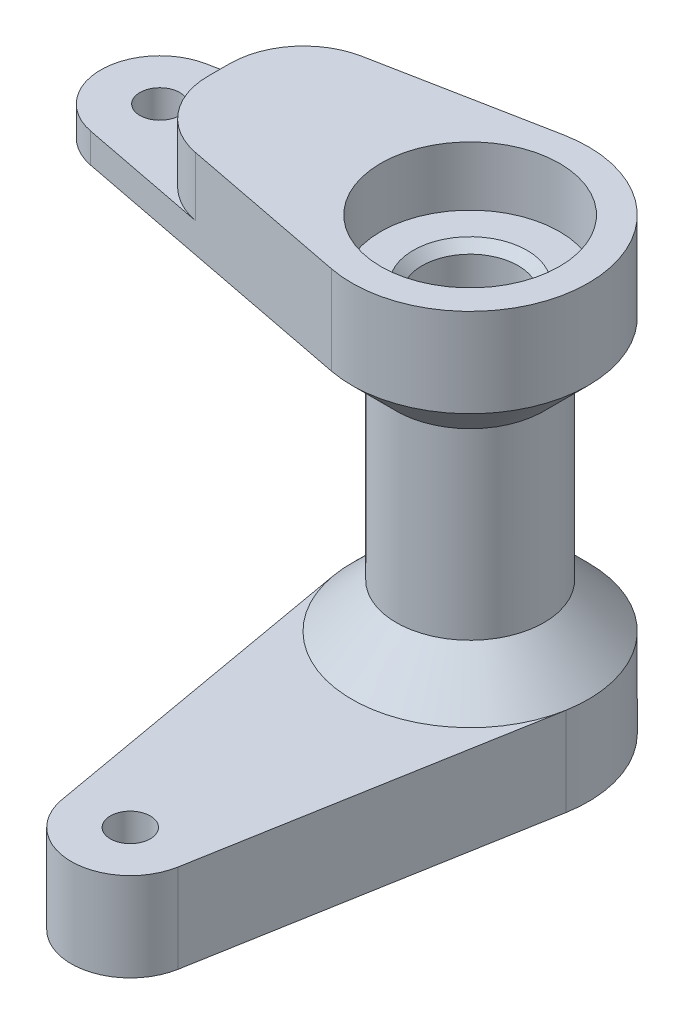
ISO-10303-21;
HEADER;
FILE_DESCRIPTION(('STEP AP214'),'2;1');
FILE_NAME('part.step','',(''),(''),'','','');
FILE_SCHEMA(('AUTOMOTIVE_DESIGN { 1 0 10303 214 1 1 1 1 }'));
ENDSEC;
DATA;
#1=APPLICATION_CONTEXT('core data for automotive mechanical design processes');
#2=APPLICATION_PROTOCOL_DEFINITION('international standard','automotive_design',2000,#1);
#3=PRODUCT_CONTEXT('',#1,'mechanical');
#4=PRODUCT('Part','Part','',(#3));
#5=PRODUCT_RELATED_PRODUCT_CATEGORY('part','',(#4));
#6=PRODUCT_DEFINITION_FORMATION('','',#4);
#7=PRODUCT_DEFINITION_CONTEXT('part definition',#1,'design');
#8=PRODUCT_DEFINITION('design','',#6,#7);
#9=PRODUCT_DEFINITION_SHAPE('','',#8);
#10=(LENGTH_UNIT() NAMED_UNIT(*) SI_UNIT(.MILLI.,.METRE.));
#11=(NAMED_UNIT(*) PLANE_ANGLE_UNIT() SI_UNIT($,.RADIAN.));
#12=(NAMED_UNIT(*) SI_UNIT($,.STERADIAN.) SOLID_ANGLE_UNIT());
#13=UNCERTAINTY_MEASURE_WITH_UNIT(LENGTH_MEASURE(1.E-05),#10,'distance_accuracy_value','');
#14=(GEOMETRIC_REPRESENTATION_CONTEXT(3) GLOBAL_UNCERTAINTY_ASSIGNED_CONTEXT((#13)) GLOBAL_UNIT_ASSIGNED_CONTEXT((#10,
#11,#12)) REPRESENTATION_CONTEXT('',''));
#15=CARTESIAN_POINT('',(0.,0.,0.));
#16=DIRECTION('',(0.,0.,1.));
#17=DIRECTION('',(1.,0.,0.));
#18=AXIS2_PLACEMENT_3D('',#15,#16,#17);
#19=CARTESIAN_POINT('',(-6.05000000000001,30.4,0.));
#20=DIRECTION('',(0.,-1.,0.));
#21=DIRECTION('',(0.,0.,-1.));
#22=AXIS2_PLACEMENT_3D('',#19,#20,#21);
#23=PLANE('',#22);
#24=CARTESIAN_POINT('',(0.,30.4,0.));
#25=DIRECTION('',(0.,-1.,0.));
#26=DIRECTION('',(0.,0.,-1.));
#27=AXIS2_PLACEMENT_3D('',#24,#25,#26);
#28=CIRCLE('',#27,6.05000000000001);
#29=CARTESIAN_POINT('',(0.,30.4,-6.05000000000001));
#30=VERTEX_POINT('',#29);
#31=EDGE_CURVE('E235',#30,#30,#28,.T.);
#32=ORIENTED_EDGE('',*,*,#31,.T.);
#33=EDGE_LOOP('',(#32));
#34=FACE_BOUND('',#33,.T.);
#35=DIRECTION('',(0.,0.,-1.));
#36=VECTOR('',#35,1.);
#37=CARTESIAN_POINT('',(-17.,30.4,27.001));
#38=LINE('',#37,#36);
#39=CARTESIAN_POINT('',(-17.,30.4,0.72760687510888));
#40=VERTEX_POINT('',#39);
#41=CARTESIAN_POINT('',(-17.,30.4,-0.72760687510913));
#42=VERTEX_POINT('',#41);
#43=EDGE_CURVE('E299',#40,#42,#38,.T.);
#44=ORIENTED_EDGE('',*,*,#43,.F.);
#45=CARTESIAN_POINT('',(-12.,30.4,0.72760687510888));
#46=DIRECTION('',(0.,-1.,0.));
#47=DIRECTION('',(0.,0.,-1.));
#48=AXIS2_PLACEMENT_3D('',#45,#46,#47);
#49=CIRCLE('',#48,5.);
#50=CARTESIAN_POINT('',(-12.952380952381,30.4,5.63606595322513));
#51=VERTEX_POINT('',#50);
#52=EDGE_CURVE('E277',#40,#51,#49,.F.);
#53=ORIENTED_EDGE('',*,*,#52,.T.);
#54=DIRECTION('',(0.98169181562325,0.,0.190476190476201));
#55=VECTOR('',#54,1.);
#56=CARTESIAN_POINT('',(-21.7619047619048,30.4,3.92676726249278));
#57=LINE('',#56,#55);
#58=CARTESIAN_POINT('',(-1.52380952380961,30.4,7.85353452498602));
#59=VERTEX_POINT('',#58);
#60=EDGE_CURVE('E305',#51,#59,#57,.T.);
#61=ORIENTED_EDGE('',*,*,#60,.T.);
#62=CARTESIAN_POINT('',(0.,30.4,0.));
#63=DIRECTION('',(0.,-1.,0.));
#64=DIRECTION('',(0.,0.,-1.));
#65=AXIS2_PLACEMENT_3D('',#62,#63,#64);
#66=CIRCLE('',#65,8.00000000000001);
#67=CARTESIAN_POINT('',(-1.52380952380945,30.4,-7.85353452498605));
#68=VERTEX_POINT('',#67);
#69=EDGE_CURVE('E231',#68,#59,#66,.T.);
#70=ORIENTED_EDGE('',*,*,#69,.F.);
#71=DIRECTION('',(-0.981691815623254,0.,0.190476190476181));
#72=VECTOR('',#71,1.);
#73=CARTESIAN_POINT('',(-21.7619047619047,30.4,-3.92676726249324));
#74=LINE('',#73,#72);
#75=CARTESIAN_POINT('',(-12.9523809523809,30.4,-5.6360659532254));
#76=VERTEX_POINT('',#75);
#77=EDGE_CURVE('E161',#68,#76,#74,.T.);
#78=ORIENTED_EDGE('',*,*,#77,.T.);
#79=CARTESIAN_POINT('',(-12.,30.4,-0.72760687510913));
#80=DIRECTION('',(0.,-1.,0.));
#81=DIRECTION('',(0.,0.,-1.));
#82=AXIS2_PLACEMENT_3D('',#79,#80,#81);
#83=CIRCLE('',#82,5.);
#84=EDGE_CURVE('E274',#76,#42,#83,.F.);
#85=ORIENTED_EDGE('',*,*,#84,.T.);
#86=EDGE_LOOP('',(#44,#53,#61,#70,#78,#85));
#87=FACE_BOUND('',#86,.T.);
#88=ADVANCED_FACE('F38',(#34,#87),#23,.F.);
#89=CARTESIAN_POINT('',(-21.,24.4,-2.19963324347117E-13));
#90=DIRECTION('',(0.,1.,0.));
#91=DIRECTION('',(0.,0.,1.));
#92=AXIS2_PLACEMENT_3D('',#89,#90,#91);
#93=CYLINDRICAL_SURFACE('',#92,4.);
#94=DIRECTION('',(0.,1.,0.));
#95=VECTOR('',#94,1.);
#96=CARTESIAN_POINT('',(-21.7619047619048,24.4,3.92676726249278));
#97=LINE('',#96,#95);
#98=CARTESIAN_POINT('',(-21.7619047619048,24.4,3.92676726249278));
#99=VERTEX_POINT('',#98);
#100=CARTESIAN_POINT('',(-21.7619047619048,26.4,3.92676726249278));
#101=VERTEX_POINT('',#100);
#102=EDGE_CURVE('E141',#99,#101,#97,.T.);
#103=ORIENTED_EDGE('',*,*,#102,.T.);
#104=CARTESIAN_POINT('',(-21.,26.4,-2.19963324347117E-13));
#105=DIRECTION('',(0.,1.,0.));
#106=DIRECTION('',(0.,0.,1.));
#107=AXIS2_PLACEMENT_3D('',#104,#105,#106);
#108=CIRCLE('',#107,4.);
#109=CARTESIAN_POINT('',(-21.7619047619047,26.4,-3.92676726249324));
#110=VERTEX_POINT('',#109);
#111=EDGE_CURVE('E128',#110,#101,#108,.T.);
#112=ORIENTED_EDGE('',*,*,#111,.F.);
#113=DIRECTION('',(0.,1.,0.));
#114=VECTOR('',#113,1.);
#115=CARTESIAN_POINT('',(-21.7619047619047,24.4,-3.92676726249324));
#116=LINE('',#115,#114);
#117=CARTESIAN_POINT('',(-21.7619047619047,24.4,-3.92676726249324));
#118=VERTEX_POINT('',#117);
#119=EDGE_CURVE('E139',#118,#110,#116,.T.);
#120=ORIENTED_EDGE('',*,*,#119,.F.);
#121=CARTESIAN_POINT('',(-21.,24.4,-2.19963324347117E-13));
#122=DIRECTION('',(0.,1.,0.));
#123=DIRECTION('',(0.,0.,1.));
#124=AXIS2_PLACEMENT_3D('',#121,#122,#123);
#125=CIRCLE('',#124,4.);
#126=EDGE_CURVE('E314',#118,#99,#125,.T.);
#127=ORIENTED_EDGE('',*,*,#126,.T.);
#128=EDGE_LOOP('',(#103,#112,#120,#127));
#129=FACE_BOUND('',#128,.T.);
#130=ADVANCED_FACE('F137',(#129),#93,.T.);
#131=CARTESIAN_POINT('',(-21.7619047619047,24.4,-3.92676726249324));
#132=DIRECTION('',(-0.190476190476181,0.,-0.981691815623254));
#133=DIRECTION('',(-0.981691815623254,0.,0.190476190476181));
#134=AXIS2_PLACEMENT_3D('',#131,#132,#133);
#135=PLANE('',#134);
#136=DIRECTION('',(0.981691815623254,0.,-0.190476190476181));
#137=VECTOR('',#136,1.);
#138=CARTESIAN_POINT('',(-24.1206817183417,26.4,-3.46909730773266));
#139=LINE('',#138,#137);
#140=CARTESIAN_POINT('',(-12.9523809523809,26.4,-5.6360659532254));
#141=VERTEX_POINT('',#140);
#142=EDGE_CURVE('E54',#110,#141,#139,.T.);
#143=ORIENTED_EDGE('',*,*,#142,.T.);
#144=DIRECTION('',(0.,1.,0.));
#145=VECTOR('',#144,1.);
#146=CARTESIAN_POINT('',(-12.9523809523809,24.4,-5.6360659532254));
#147=LINE('',#146,#145);
#148=EDGE_CURVE('E283',#141,#76,#147,.T.);
#149=ORIENTED_EDGE('',*,*,#148,.T.);
#150=ORIENTED_EDGE('',*,*,#77,.F.);
#151=DIRECTION('',(0.,1.,0.));
#152=VECTOR('',#151,1.);
#153=CARTESIAN_POINT('',(-1.52380952380945,24.4,-7.85353452498605));
#154=LINE('',#153,#152);
#155=CARTESIAN_POINT('',(-1.52380952380945,24.4,-7.85353452498604));
#156=VERTEX_POINT('',#155);
#157=EDGE_CURVE('E150',#156,#68,#154,.T.);
#158=ORIENTED_EDGE('',*,*,#157,.F.);
#159=DIRECTION('',(-0.981691815623254,0.,0.190476190476181));
#160=VECTOR('',#159,1.);
#161=CARTESIAN_POINT('',(-21.7619047619047,24.4,-3.92676726249324));
#162=LINE('',#161,#160);
#163=EDGE_CURVE('E147',#156,#118,#162,.T.);
#164=ORIENTED_EDGE('',*,*,#163,.T.);
#165=ORIENTED_EDGE('',*,*,#119,.T.);
#166=EDGE_LOOP('',(#143,#149,#150,#158,#164,#165));
#167=FACE_BOUND('',#166,.T.);
#168=ADVANCED_FACE('F145',(#167),#135,.T.);
#169=CARTESIAN_POINT('',(-21.7619047619048,24.4,3.92676726249278));
#170=DIRECTION('',(-0.190476190476201,0.,0.981691815623251));
#171=DIRECTION('',(0.98169181562325,0.,0.190476190476201));
#172=AXIS2_PLACEMENT_3D('',#169,#170,#171);
#173=PLANE('',#172);
#174=ORIENTED_EDGE('',*,*,#60,.F.);
#175=DIRECTION('',(0.,1.,0.));
#176=VECTOR('',#175,1.);
#177=CARTESIAN_POINT('',(-12.952380952381,24.4,5.63606595322513));
#178=LINE('',#177,#176);
#179=CARTESIAN_POINT('',(-12.952380952381,26.4,5.63606595322513));
#180=VERTEX_POINT('',#179);
#181=EDGE_CURVE('E280',#51,#180,#178,.F.);
#182=ORIENTED_EDGE('',*,*,#181,.T.);
#183=DIRECTION('',(0.98169181562325,0.,0.190476190476201));
#184=VECTOR('',#183,1.);
#185=CARTESIAN_POINT('',(-20.5678922903715,26.4,4.1584397113604));
#186=LINE('',#185,#184);
#187=EDGE_CURVE('E61',#101,#180,#186,.T.);
#188=ORIENTED_EDGE('',*,*,#187,.F.);
#189=ORIENTED_EDGE('',*,*,#102,.F.);
#190=DIRECTION('',(0.98169181562325,0.,0.190476190476201));
#191=VECTOR('',#190,1.);
#192=CARTESIAN_POINT('',(-21.7619047619048,24.4,3.92676726249278));
#193=LINE('',#192,#191);
#194=CARTESIAN_POINT('',(-1.52380952380961,24.4,7.85353452498602));
#195=VERTEX_POINT('',#194);
#196=EDGE_CURVE('E320',#99,#195,#193,.T.);
#197=ORIENTED_EDGE('',*,*,#196,.T.);
#198=DIRECTION('',(0.,1.,0.));
#199=VECTOR('',#198,1.);
#200=CARTESIAN_POINT('',(-1.52380952380961,24.4,7.85353452498602));
#201=LINE('',#200,#199);
#202=EDGE_CURVE('E158',#195,#59,#201,.T.);
#203=ORIENTED_EDGE('',*,*,#202,.T.);
#204=EDGE_LOOP('',(#174,#182,#188,#189,#197,#203));
#205=FACE_BOUND('',#204,.T.);
#206=ADVANCED_FACE('F307',(#205),#173,.T.);
#207=CARTESIAN_POINT('',(-21.,24.4,-2.19963324347117E-13));
#208=DIRECTION('',(0.,1.,0.));
#209=DIRECTION('',(0.,0.,1.));
#210=AXIS2_PLACEMENT_3D('',#207,#208,#209);
#211=CYLINDRICAL_SURFACE('',#210,1.35);
#212=CARTESIAN_POINT('',(-21.,24.4,-2.19963324347117E-13));
#213=DIRECTION('',(0.,1.,0.));
#214=DIRECTION('',(0.,0.,1.));
#215=AXIS2_PLACEMENT_3D('',#212,#213,#214);
#216=CIRCLE('',#215,1.35);
#217=CARTESIAN_POINT('',(-21.,24.4,1.34999999999978));
#218=VERTEX_POINT('',#217);
#219=EDGE_CURVE('E298',#218,#218,#216,.T.);
#220=ORIENTED_EDGE('',*,*,#219,.F.);
#221=EDGE_LOOP('',(#220));
#222=FACE_BOUND('',#221,.T.);
#223=CARTESIAN_POINT('',(-21.,26.4,-2.19963324347117E-13));
#224=DIRECTION('',(0.,1.,0.));
#225=DIRECTION('',(0.,0.,1.));
#226=AXIS2_PLACEMENT_3D('',#223,#224,#225);
#227=CIRCLE('',#226,1.35);
#228=CARTESIAN_POINT('',(-21.,26.4,1.34999999999978));
#229=VERTEX_POINT('',#228);
#230=EDGE_CURVE('E133',#229,#229,#227,.T.);
#231=ORIENTED_EDGE('',*,*,#230,.T.);
#232=EDGE_LOOP('',(#231));
#233=FACE_BOUND('',#232,.T.);
#234=ADVANCED_FACE('F333',(#222,#233),#211,.F.);
#235=CARTESIAN_POINT('',(0.,-1.14422068437634,0.));
#236=DIRECTION('',(0.,-1.,0.));
#237=DIRECTION('',(0.,0.,-1.));
#238=AXIS2_PLACEMENT_3D('',#235,#236,#237);
#239=CYLINDRICAL_SURFACE('',#238,8.00000000000001);
#240=ORIENTED_EDGE('',*,*,#157,.T.);
#241=ORIENTED_EDGE('',*,*,#69,.T.);
#242=ORIENTED_EDGE('',*,*,#202,.F.);
#243=CARTESIAN_POINT('',(0.,24.4,0.));
#244=DIRECTION('',(0.,-1.,0.));
#245=DIRECTION('',(0.,0.,-1.));
#246=AXIS2_PLACEMENT_3D('',#243,#244,#245);
#247=CIRCLE('',#246,8.);
#248=EDGE_CURVE('E226',#156,#195,#247,.T.);
#249=ORIENTED_EDGE('',*,*,#248,.F.);
#250=EDGE_LOOP('',(#240,#241,#242,#249));
#251=FACE_BOUND('',#250,.T.);
#252=ADVANCED_FACE('F358',(#251),#239,.T.);
#253=CARTESIAN_POINT('',(-7.99999999999998,0.,0.));
#254=DIRECTION('',(0.,1.,0.));
#255=DIRECTION('',(0.,0.,1.));
#256=AXIS2_PLACEMENT_3D('',#253,#254,#255);
#257=PLANE('',#256);
#258=CARTESIAN_POINT('',(0.,0.,0.));
#259=DIRECTION('',(0.,-1.,0.));
#260=DIRECTION('',(0.,0.,-1.));
#261=AXIS2_PLACEMENT_3D('',#258,#259,#260);
#262=CIRCLE('',#261,6.04999999999997);
#263=CARTESIAN_POINT('',(0.,0.,-6.04999999999997));
#264=VERTEX_POINT('',#263);
#265=EDGE_CURVE('E263',#264,#264,#262,.T.);
#266=ORIENTED_EDGE('',*,*,#265,.F.);
#267=EDGE_LOOP('',(#266));
#268=FACE_BOUND('',#267,.T.);
#269=CARTESIAN_POINT('',(0.,0.,0.));
#270=DIRECTION('',(0.,-1.,0.));
#271=DIRECTION('',(0.,0.,-1.));
#272=AXIS2_PLACEMENT_3D('',#269,#270,#271);
#273=CIRCLE('',#272,7.99999999999998);
#274=CARTESIAN_POINT('',(-7.87808810636948,0.,1.39130434782608));
#275=VERTEX_POINT('',#274);
#276=CARTESIAN_POINT('',(7.87808810636946,0.,1.39130434782608));
#277=VERTEX_POINT('',#276);
#278=EDGE_CURVE('E209',#275,#277,#273,.T.);
#279=ORIENTED_EDGE('',*,*,#278,.T.);
#280=DIRECTION('',(0.173913043478261,0.,-0.984761013296185));
#281=VECTOR('',#280,1.);
#282=CARTESIAN_POINT('',(3.93904405318474,0.,23.695652173913));
#283=LINE('',#282,#281);
#284=CARTESIAN_POINT('',(3.93904405318474,0.,23.695652173913));
#285=VERTEX_POINT('',#284);
#286=EDGE_CURVE('E189',#285,#277,#283,.T.);
#287=ORIENTED_EDGE('',*,*,#286,.F.);
#288=CARTESIAN_POINT('',(0.,0.,23.));
#289=DIRECTION('',(0.,1.,0.));
#290=DIRECTION('',(0.,0.,-1.));
#291=AXIS2_PLACEMENT_3D('',#288,#289,#290);
#292=CIRCLE('',#291,4.);
#293=CARTESIAN_POINT('',(-3.93904405318474,0.,23.695652173913));
#294=VERTEX_POINT('',#293);
#295=EDGE_CURVE('E171',#294,#285,#292,.T.);
#296=ORIENTED_EDGE('',*,*,#295,.F.);
#297=DIRECTION('',(0.173913043478261,0.,0.984761013296185));
#298=VECTOR('',#297,1.);
#299=CARTESIAN_POINT('',(-7.87808810636948,0.,1.39130434782609));
#300=LINE('',#299,#298);
#301=EDGE_CURVE('E178',#275,#294,#300,.T.);
#302=ORIENTED_EDGE('',*,*,#301,.F.);
#303=EDGE_LOOP('',(#279,#287,#296,#302));
#304=FACE_BOUND('',#303,.T.);
#305=CARTESIAN_POINT('',(0.,0.,23.));
#306=DIRECTION('',(0.,1.,0.));
#307=DIRECTION('',(0.,0.,1.));
#308=AXIS2_PLACEMENT_3D('',#305,#306,#307);
#309=CIRCLE('',#308,1.35);
#310=CARTESIAN_POINT('',(0.,0.,24.35));
#311=VERTEX_POINT('',#310);
#312=EDGE_CURVE('E149',#311,#311,#309,.T.);
#313=ORIENTED_EDGE('',*,*,#312,.T.);
#314=EDGE_LOOP('',(#313));
#315=FACE_BOUND('',#314,.T.);
#316=ADVANCED_FACE('F388',(#268,#304,#315),#257,.F.);
#317=CARTESIAN_POINT('',(0.,-1.14422068437634,0.));
#318=DIRECTION('',(0.,-1.,0.));
#319=DIRECTION('',(0.,0.,-1.));
#320=AXIS2_PLACEMENT_3D('',#317,#318,#319);
#321=CYLINDRICAL_SURFACE('',#320,6.04999999999997);
#322=CARTESIAN_POINT('',(0.,4.,0.));
#323=DIRECTION('',(0.,-1.,0.));
#324=DIRECTION('',(0.,0.,-1.));
#325=AXIS2_PLACEMENT_3D('',#322,#323,#324);
#326=CIRCLE('',#325,6.04999999999997);
#327=CARTESIAN_POINT('',(0.,4.,-6.04999999999997));
#328=VERTEX_POINT('',#327);
#329=EDGE_CURVE('E259',#328,#328,#326,.T.);
#330=ORIENTED_EDGE('',*,*,#329,.F.);
#331=EDGE_LOOP('',(#330));
#332=FACE_BOUND('',#331,.T.);
#333=ORIENTED_EDGE('',*,*,#265,.T.);
#334=EDGE_LOOP('',(#333));
#335=FACE_BOUND('',#334,.T.);
#336=ADVANCED_FACE('F384',(#332,#335),#321,.F.);
#337=CARTESIAN_POINT('',(-6.04999999999997,4.,0.));
#338=DIRECTION('',(0.,1.,0.));
#339=DIRECTION('',(0.,0.,1.));
#340=AXIS2_PLACEMENT_3D('',#337,#338,#339);
#341=PLANE('',#340);
#342=CARTESIAN_POINT('',(0.,4.,0.));
#343=DIRECTION('',(0.,-1.,0.));
#344=DIRECTION('',(0.,0.,-1.));
#345=AXIS2_PLACEMENT_3D('',#342,#343,#344);
#346=CIRCLE('',#345,3.85);
#347=CARTESIAN_POINT('',(0.,4.,-3.85));
#348=VERTEX_POINT('',#347);
#349=EDGE_CURVE('E255',#348,#348,#346,.T.);
#350=ORIENTED_EDGE('',*,*,#349,.F.);
#351=EDGE_LOOP('',(#350));
#352=FACE_BOUND('',#351,.T.);
#353=ORIENTED_EDGE('',*,*,#329,.T.);
#354=EDGE_LOOP('',(#353));
#355=FACE_BOUND('',#354,.T.);
#356=ADVANCED_FACE('F380',(#352,#355),#341,.F.);
#357=CARTESIAN_POINT('',(0.,4.,0.));
#358=DIRECTION('',(0.,-1.,0.));
#359=DIRECTION('',(0.,0.,-1.));
#360=AXIS2_PLACEMENT_3D('',#357,#358,#359);
#361=CONICAL_SURFACE('',#360,3.85,0.785398163397448);
#362=CARTESIAN_POINT('',(0.,4.6,0.));
#363=DIRECTION('',(0.,-1.,0.));
#364=DIRECTION('',(0.,0.,-1.));
#365=AXIS2_PLACEMENT_3D('',#362,#363,#364);
#366=CIRCLE('',#365,3.25);
#367=CARTESIAN_POINT('',(0.,4.6,-3.25));
#368=VERTEX_POINT('',#367);
#369=EDGE_CURVE('E251',#368,#368,#366,.T.);
#370=ORIENTED_EDGE('',*,*,#369,.F.);
#371=EDGE_LOOP('',(#370));
#372=FACE_BOUND('',#371,.T.);
#373=ORIENTED_EDGE('',*,*,#349,.T.);
#374=EDGE_LOOP('',(#373));
#375=FACE_BOUND('',#374,.T.);
#376=ADVANCED_FACE('F376',(#372,#375),#361,.F.);
#377=CARTESIAN_POINT('',(0.,-1.14422068437634,0.));
#378=DIRECTION('',(0.,-1.,0.));
#379=DIRECTION('',(0.,0.,-1.));
#380=AXIS2_PLACEMENT_3D('',#377,#378,#379);
#381=CYLINDRICAL_SURFACE('',#380,3.25);
#382=CARTESIAN_POINT('',(0.,25.8,0.));
#383=DIRECTION('',(0.,-1.,0.));
#384=DIRECTION('',(0.,0.,-1.));
#385=AXIS2_PLACEMENT_3D('',#382,#383,#384);
#386=CIRCLE('',#385,3.25);
#387=CARTESIAN_POINT('',(0.,25.8,-3.25));
#388=VERTEX_POINT('',#387);
#389=EDGE_CURVE('E247',#388,#388,#386,.T.);
#390=ORIENTED_EDGE('',*,*,#389,.F.);
#391=EDGE_LOOP('',(#390));
#392=FACE_BOUND('',#391,.T.);
#393=ORIENTED_EDGE('',*,*,#369,.T.);
#394=EDGE_LOOP('',(#393));
#395=FACE_BOUND('',#394,.T.);
#396=ADVANCED_FACE('F372',(#392,#395),#381,.F.);
#397=CARTESIAN_POINT('',(0.,25.8,0.));
#398=DIRECTION('',(0.,1.,0.));
#399=DIRECTION('',(0.,0.,1.));
#400=AXIS2_PLACEMENT_3D('',#397,#398,#399);
#401=CONICAL_SURFACE('',#400,3.25,0.785398163397448);
#402=CARTESIAN_POINT('',(0.,26.4,0.));
#403=DIRECTION('',(0.,-1.,0.));
#404=DIRECTION('',(0.,0.,-1.));
#405=AXIS2_PLACEMENT_3D('',#402,#403,#404);
#406=CIRCLE('',#405,3.85);
#407=CARTESIAN_POINT('',(0.,26.4,-3.85));
#408=VERTEX_POINT('',#407);
#409=EDGE_CURVE('E243',#408,#408,#406,.T.);
#410=ORIENTED_EDGE('',*,*,#409,.F.);
#411=EDGE_LOOP('',(#410));
#412=FACE_BOUND('',#411,.T.);
#413=ORIENTED_EDGE('',*,*,#389,.T.);
#414=EDGE_LOOP('',(#413));
#415=FACE_BOUND('',#414,.T.);
#416=ADVANCED_FACE('F368',(#412,#415),#401,.F.);
#417=CARTESIAN_POINT('',(-3.85,26.4,0.));
#418=DIRECTION('',(0.,-1.,0.));
#419=DIRECTION('',(0.,0.,-1.));
#420=AXIS2_PLACEMENT_3D('',#417,#418,#419);
#421=PLANE('',#420);
#422=CARTESIAN_POINT('',(0.,26.4,0.));
#423=DIRECTION('',(0.,-1.,0.));
#424=DIRECTION('',(0.,0.,-1.));
#425=AXIS2_PLACEMENT_3D('',#422,#423,#424);
#426=CIRCLE('',#425,6.05);
#427=CARTESIAN_POINT('',(0.,26.4,-6.05));
#428=VERTEX_POINT('',#427);
#429=EDGE_CURVE('E239',#428,#428,#426,.T.);
#430=ORIENTED_EDGE('',*,*,#429,.F.);
#431=EDGE_LOOP('',(#430));
#432=FACE_BOUND('',#431,.T.);
#433=ORIENTED_EDGE('',*,*,#409,.T.);
#434=EDGE_LOOP('',(#433));
#435=FACE_BOUND('',#434,.T.);
#436=ADVANCED_FACE('F364',(#432,#435),#421,.F.);
#437=CARTESIAN_POINT('',(0.,-1.14422068437634,0.));
#438=DIRECTION('',(0.,-1.,0.));
#439=DIRECTION('',(0.,0.,-1.));
#440=AXIS2_PLACEMENT_3D('',#437,#438,#439);
#441=CYLINDRICAL_SURFACE('',#440,6.05000000000001);
#442=ORIENTED_EDGE('',*,*,#31,.F.);
#443=EDGE_LOOP('',(#442));
#444=FACE_BOUND('',#443,.T.);
#445=ORIENTED_EDGE('',*,*,#429,.T.);
#446=EDGE_LOOP('',(#445));
#447=FACE_BOUND('',#446,.T.);
#448=ADVANCED_FACE('F360',(#444,#447),#441,.F.);
#449=CARTESIAN_POINT('',(0.,24.4,0.));
#450=DIRECTION('',(0.,1.,0.));
#451=DIRECTION('',(0.,0.,1.));
#452=AXIS2_PLACEMENT_3D('',#449,#450,#451);
#453=CONICAL_SURFACE('',#452,8.,0.785398163397448);
#454=CARTESIAN_POINT('',(0.,21.4,0.));
#455=DIRECTION('',(0.,-1.,0.));
#456=DIRECTION('',(0.,0.,-1.));
#457=AXIS2_PLACEMENT_3D('',#454,#455,#456);
#458=CIRCLE('',#457,5.);
#459=CARTESIAN_POINT('',(0.,21.4,-5.));
#460=VERTEX_POINT('',#459);
#461=EDGE_CURVE('E222',#460,#460,#458,.T.);
#462=ORIENTED_EDGE('',*,*,#461,.F.);
#463=EDGE_LOOP('',(#462));
#464=FACE_BOUND('',#463,.T.);
#465=EDGE_CURVE('E227',#195,#156,#247,.T.);
#466=ORIENTED_EDGE('',*,*,#465,.T.);
#467=ORIENTED_EDGE('',*,*,#248,.T.);
#468=EDGE_LOOP('',(#466,#467));
#469=FACE_BOUND('',#468,.T.);
#470=ADVANCED_FACE('F363',(#464,#469),#453,.T.);
#471=CARTESIAN_POINT('',(0.,-1.14422068437634,0.));
#472=DIRECTION('',(0.,-1.,0.));
#473=DIRECTION('',(0.,0.,-1.));
#474=AXIS2_PLACEMENT_3D('',#471,#472,#473);
#475=CYLINDRICAL_SURFACE('',#474,4.99999999999999);
#476=CARTESIAN_POINT('',(0.,9.00000000000004,0.));
#477=DIRECTION('',(0.,-1.,0.));
#478=DIRECTION('',(0.,0.,-1.));
#479=AXIS2_PLACEMENT_3D('',#476,#477,#478);
#480=CIRCLE('',#479,4.99999999999999);
#481=CARTESIAN_POINT('',(0.,9.00000000000004,-4.99999999999999));
#482=VERTEX_POINT('',#481);
#483=EDGE_CURVE('E218',#482,#482,#480,.T.);
#484=ORIENTED_EDGE('',*,*,#483,.F.);
#485=EDGE_LOOP('',(#484));
#486=FACE_BOUND('',#485,.T.);
#487=ORIENTED_EDGE('',*,*,#461,.T.);
#488=EDGE_LOOP('',(#487));
#489=FACE_BOUND('',#488,.T.);
#490=ADVANCED_FACE('F407',(#486,#489),#475,.T.);
#491=CARTESIAN_POINT('',(0.,9.00000000000004,0.));
#492=DIRECTION('',(0.,-1.,0.));
#493=DIRECTION('',(0.,0.,-1.));
#494=AXIS2_PLACEMENT_3D('',#491,#492,#493);
#495=CONICAL_SURFACE('',#494,4.99999999999999,0.785398163397448);
#496=CARTESIAN_POINT('',(0.,6.00000000000003,0.));
#497=DIRECTION('',(0.,-1.,0.));
#498=DIRECTION('',(0.,0.,-1.));
#499=AXIS2_PLACEMENT_3D('',#496,#497,#498);
#500=CIRCLE('',#499,7.99999999999999);
#501=CARTESIAN_POINT('',(7.87808810636947,6.00000000000003,1.39130434782608));
#502=VERTEX_POINT('',#501);
#503=CARTESIAN_POINT('',(-7.87808810636947,6.00000000000003,1.39130434782608));
#504=VERTEX_POINT('',#503);
#505=EDGE_CURVE('E214',#502,#504,#500,.T.);
#506=ORIENTED_EDGE('',*,*,#505,.F.);
#507=EDGE_CURVE('E213',#504,#502,#500,.T.);
#508=ORIENTED_EDGE('',*,*,#507,.F.);
#509=EDGE_LOOP('',(#506,#508));
#510=FACE_BOUND('',#509,.T.);
#511=ORIENTED_EDGE('',*,*,#483,.T.);
#512=EDGE_LOOP('',(#511));
#513=FACE_BOUND('',#512,.T.);
#514=ADVANCED_FACE('F412',(#510,#513),#495,.T.);
#515=CARTESIAN_POINT('',(0.,-1.14422068437634,0.));
#516=DIRECTION('',(0.,-1.,0.));
#517=DIRECTION('',(0.,0.,-1.));
#518=AXIS2_PLACEMENT_3D('',#515,#516,#517);
#519=CYLINDRICAL_SURFACE('',#518,7.99999999999999);
#520=ORIENTED_EDGE('',*,*,#507,.T.);
#521=DIRECTION('',(0.,-1.,0.));
#522=VECTOR('',#521,1.);
#523=CARTESIAN_POINT('',(7.87808810636948,6.00000000000003,1.39130434782609));
#524=LINE('',#523,#522);
#525=EDGE_CURVE('E202',#502,#277,#524,.T.);
#526=ORIENTED_EDGE('',*,*,#525,.T.);
#527=ORIENTED_EDGE('',*,*,#278,.F.);
#528=DIRECTION('',(0.,-1.,0.));
#529=VECTOR('',#528,1.);
#530=CARTESIAN_POINT('',(-7.87808810636948,6.00000000000003,1.39130434782608));
#531=LINE('',#530,#529);
#532=EDGE_CURVE('E198',#504,#275,#531,.T.);
#533=ORIENTED_EDGE('',*,*,#532,.F.);
#534=EDGE_LOOP('',(#520,#526,#527,#533));
#535=FACE_BOUND('',#534,.T.);
#536=ADVANCED_FACE('F419',(#535),#519,.T.);
#537=CARTESIAN_POINT('',(0.,6.00000000000003,23.));
#538=DIRECTION('',(0.,-1.,0.));
#539=DIRECTION('',(0.,0.,-1.));
#540=AXIS2_PLACEMENT_3D('',#537,#538,#539);
#541=PLANE('',#540);
#542=CARTESIAN_POINT('',(0.,6.00000000000003,23.));
#543=DIRECTION('',(0.,1.,0.));
#544=DIRECTION('',(0.,0.,-1.));
#545=AXIS2_PLACEMENT_3D('',#542,#543,#544);
#546=CIRCLE('',#545,4.);
#547=CARTESIAN_POINT('',(-3.93904405318474,6.00000000000003,23.695652173913));
#548=VERTEX_POINT('',#547);
#549=CARTESIAN_POINT('',(3.93904405318474,6.00000000000003,23.695652173913));
#550=VERTEX_POINT('',#549);
#551=EDGE_CURVE('E173',#548,#550,#546,.T.);
#552=ORIENTED_EDGE('',*,*,#551,.T.);
#553=DIRECTION('',(0.173913043478261,0.,-0.984761013296185));
#554=VECTOR('',#553,1.);
#555=CARTESIAN_POINT('',(3.93904405318474,6.00000000000003,23.695652173913));
#556=LINE('',#555,#554);
#557=EDGE_CURVE('E177',#550,#502,#556,.T.);
#558=ORIENTED_EDGE('',*,*,#557,.T.);
#559=ORIENTED_EDGE('',*,*,#505,.T.);
#560=DIRECTION('',(0.173913043478261,0.,0.984761013296185));
#561=VECTOR('',#560,1.);
#562=CARTESIAN_POINT('',(-7.87808810636948,6.00000000000003,1.39130434782609));
#563=LINE('',#562,#561);
#564=EDGE_CURVE('E182',#504,#548,#563,.T.);
#565=ORIENTED_EDGE('',*,*,#564,.T.);
#566=EDGE_LOOP('',(#552,#558,#559,#565));
#567=FACE_BOUND('',#566,.T.);
#568=CARTESIAN_POINT('',(0.,6.00000000000003,23.));
#569=DIRECTION('',(0.,1.,0.));
#570=DIRECTION('',(0.,0.,1.));
#571=AXIS2_PLACEMENT_3D('',#568,#569,#570);
#572=CIRCLE('',#571,1.35);
#573=CARTESIAN_POINT('',(0.,6.00000000000003,24.35));
#574=VERTEX_POINT('',#573);
#575=EDGE_CURVE('E155',#574,#574,#572,.T.);
#576=ORIENTED_EDGE('',*,*,#575,.F.);
#577=EDGE_LOOP('',(#576));
#578=FACE_BOUND('',#577,.T.);
#579=ADVANCED_FACE('F423',(#567,#578),#541,.F.);
#580=CARTESIAN_POINT('',(0.,6.00000000000003,23.));
#581=DIRECTION('',(0.,-1.,0.));
#582=DIRECTION('',(0.,0.,-1.));
#583=AXIS2_PLACEMENT_3D('',#580,#581,#582);
#584=CYLINDRICAL_SURFACE('',#583,4.);
#585=ORIENTED_EDGE('',*,*,#295,.T.);
#586=DIRECTION('',(0.,-1.,0.));
#587=VECTOR('',#586,1.);
#588=CARTESIAN_POINT('',(3.93904405318474,6.00000000000003,23.695652173913));
#589=LINE('',#588,#587);
#590=EDGE_CURVE('E205',#550,#285,#589,.T.);
#591=ORIENTED_EDGE('',*,*,#590,.F.);
#592=ORIENTED_EDGE('',*,*,#551,.F.);
#593=DIRECTION('',(0.,-1.,0.));
#594=VECTOR('',#593,1.);
#595=CARTESIAN_POINT('',(-3.93904405318474,6.00000000000003,23.695652173913));
#596=LINE('',#595,#594);
#597=EDGE_CURVE('E185',#548,#294,#596,.T.);
#598=ORIENTED_EDGE('',*,*,#597,.T.);
#599=EDGE_LOOP('',(#585,#591,#592,#598));
#600=FACE_BOUND('',#599,.T.);
#601=ADVANCED_FACE('F425',(#600),#584,.T.);
#602=CARTESIAN_POINT('',(3.93904405318474,6.00000000000003,23.695652173913));
#603=DIRECTION('',(-0.984761013296185,0.,-0.173913043478261));
#604=DIRECTION('',(-0.173913043478261,0.,0.984761013296185));
#605=AXIS2_PLACEMENT_3D('',#602,#603,#604);
#606=PLANE('',#605);
#607=ORIENTED_EDGE('',*,*,#286,.T.);
#608=ORIENTED_EDGE('',*,*,#525,.F.);
#609=ORIENTED_EDGE('',*,*,#557,.F.);
#610=ORIENTED_EDGE('',*,*,#590,.T.);
#611=EDGE_LOOP('',(#607,#608,#609,#610));
#612=FACE_BOUND('',#611,.T.);
#613=ADVANCED_FACE('F428',(#612),#606,.F.);
#614=CARTESIAN_POINT('',(-7.87808810636948,6.00000000000003,1.39130434782609));
#615=DIRECTION('',(0.984761013296185,0.,-0.173913043478261));
#616=DIRECTION('',(-0.173913043478261,0.,-0.984761013296185));
#617=AXIS2_PLACEMENT_3D('',#614,#615,#616);
#618=PLANE('',#617);
#619=ORIENTED_EDGE('',*,*,#301,.T.);
#620=ORIENTED_EDGE('',*,*,#597,.F.);
#621=ORIENTED_EDGE('',*,*,#564,.F.);
#622=ORIENTED_EDGE('',*,*,#532,.T.);
#623=EDGE_LOOP('',(#619,#620,#621,#622));
#624=FACE_BOUND('',#623,.T.);
#625=ADVANCED_FACE('F432',(#624),#618,.F.);
#626=CARTESIAN_POINT('',(0.,6.00000000000003,23.));
#627=DIRECTION('',(0.,-1.,0.));
#628=DIRECTION('',(0.,0.,-1.));
#629=AXIS2_PLACEMENT_3D('',#626,#627,#628);
#630=CYLINDRICAL_SURFACE('',#629,1.35);
#631=ORIENTED_EDGE('',*,*,#575,.T.);
#632=EDGE_LOOP('',(#631));
#633=FACE_BOUND('',#632,.T.);
#634=ORIENTED_EDGE('',*,*,#312,.F.);
#635=EDGE_LOOP('',(#634));
#636=FACE_BOUND('',#635,.T.);
#637=ADVANCED_FACE('F343',(#633,#636),#630,.F.);
#638=CARTESIAN_POINT('',(-21.,24.4,-2.19963324347117E-13));
#639=DIRECTION('',(0.,1.,0.));
#640=DIRECTION('',(0.,0.,1.));
#641=AXIS2_PLACEMENT_3D('',#638,#639,#640);
#642=PLANE('',#641);
#643=ORIENTED_EDGE('',*,*,#219,.T.);
#644=EDGE_LOOP('',(#643));
#645=FACE_BOUND('',#644,.T.);
#646=ORIENTED_EDGE('',*,*,#126,.F.);
#647=ORIENTED_EDGE('',*,*,#163,.F.);
#648=ORIENTED_EDGE('',*,*,#465,.F.);
#649=ORIENTED_EDGE('',*,*,#196,.F.);
#650=EDGE_LOOP('',(#646,#647,#648,#649));
#651=FACE_BOUND('',#650,.T.);
#652=ADVANCED_FACE('F335',(#645,#651),#642,.F.);
#653=CARTESIAN_POINT('',(-25.,26.4,27.001));
#654=DIRECTION('',(0.,1.,0.));
#655=DIRECTION('',(0.,0.,1.));
#656=AXIS2_PLACEMENT_3D('',#653,#654,#655);
#657=PLANE('',#656);
#658=ORIENTED_EDGE('',*,*,#142,.F.);
#659=ORIENTED_EDGE('',*,*,#111,.T.);
#660=ORIENTED_EDGE('',*,*,#187,.T.);
#661=CARTESIAN_POINT('',(-12.,26.4,0.72760687510888));
#662=DIRECTION('',(0.,1.,0.));
#663=DIRECTION('',(0.,0.,1.));
#664=AXIS2_PLACEMENT_3D('',#661,#662,#663);
#665=CIRCLE('',#664,5.);
#666=CARTESIAN_POINT('',(-17.,26.4,0.72760687510888));
#667=VERTEX_POINT('',#666);
#668=EDGE_CURVE('E47',#180,#667,#665,.F.);
#669=ORIENTED_EDGE('',*,*,#668,.T.);
#670=DIRECTION('',(0.,0.,-1.));
#671=VECTOR('',#670,1.);
#672=CARTESIAN_POINT('',(-17.,26.4,27.001));
#673=LINE('',#672,#671);
#674=CARTESIAN_POINT('',(-17.,26.4,-0.72760687510913));
#675=VERTEX_POINT('',#674);
#676=EDGE_CURVE('E288',#667,#675,#673,.T.);
#677=ORIENTED_EDGE('',*,*,#676,.T.);
#678=CARTESIAN_POINT('',(-12.,26.4,-0.72760687510913));
#679=DIRECTION('',(0.,1.,0.));
#680=DIRECTION('',(0.,0.,1.));
#681=AXIS2_PLACEMENT_3D('',#678,#679,#680);
#682=CIRCLE('',#681,5.);
#683=EDGE_CURVE('E11',#675,#141,#682,.F.);
#684=ORIENTED_EDGE('',*,*,#683,.T.);
#685=EDGE_LOOP('',(#658,#659,#660,#669,#677,#684));
#686=FACE_BOUND('',#685,.T.);
#687=ORIENTED_EDGE('',*,*,#230,.F.);
#688=EDGE_LOOP('',(#687));
#689=FACE_BOUND('',#688,.T.);
#690=ADVANCED_FACE('F126',(#686,#689),#657,.T.);
#691=CARTESIAN_POINT('',(-17.,30.4,27.001));
#692=DIRECTION('',(-1.,0.,0.));
#693=DIRECTION('',(0.,0.,1.));
#694=AXIS2_PLACEMENT_3D('',#691,#692,#693);
#695=PLANE('',#694);
#696=ORIENTED_EDGE('',*,*,#676,.F.);
#697=DIRECTION('',(0.,1.,0.));
#698=VECTOR('',#697,1.);
#699=CARTESIAN_POINT('',(-17.,30.4,0.72760687510888));
#700=LINE('',#699,#698);
#701=EDGE_CURVE('E270',#667,#40,#700,.T.);
#702=ORIENTED_EDGE('',*,*,#701,.T.);
#703=ORIENTED_EDGE('',*,*,#43,.T.);
#704=DIRECTION('',(0.,1.,0.));
#705=VECTOR('',#704,1.);
#706=CARTESIAN_POINT('',(-17.,30.4,-0.72760687510913));
#707=LINE('',#706,#705);
#708=EDGE_CURVE('E267',#42,#675,#707,.F.);
#709=ORIENTED_EDGE('',*,*,#708,.T.);
#710=EDGE_LOOP('',(#696,#702,#703,#709));
#711=FACE_BOUND('',#710,.T.);
#712=ADVANCED_FACE('F293',(#711),#695,.T.);
#713=CARTESIAN_POINT('',(-12.,30.4,0.72760687510888));
#714=DIRECTION('',(0.,1.,0.));
#715=DIRECTION('',(0.,0.,1.));
#716=AXIS2_PLACEMENT_3D('',#713,#714,#715);
#717=CYLINDRICAL_SURFACE('',#716,5.);
#718=ORIENTED_EDGE('',*,*,#668,.F.);
#719=ORIENTED_EDGE('',*,*,#181,.F.);
#720=ORIENTED_EDGE('',*,*,#52,.F.);
#721=ORIENTED_EDGE('',*,*,#701,.F.);
#722=EDGE_LOOP('',(#718,#719,#720,#721));
#723=FACE_BOUND('',#722,.T.);
#724=ADVANCED_FACE('F301',(#723),#717,.T.);
#725=CARTESIAN_POINT('',(-12.,24.4,-0.72760687510913));
#726=DIRECTION('',(0.,1.,0.));
#727=DIRECTION('',(0.,0.,1.));
#728=AXIS2_PLACEMENT_3D('',#725,#726,#727);
#729=CYLINDRICAL_SURFACE('',#728,5.);
#730=ORIENTED_EDGE('',*,*,#683,.F.);
#731=ORIENTED_EDGE('',*,*,#708,.F.);
#732=ORIENTED_EDGE('',*,*,#84,.F.);
#733=ORIENTED_EDGE('',*,*,#148,.F.);
#734=EDGE_LOOP('',(#730,#731,#732,#733));
#735=FACE_BOUND('',#734,.T.);
#736=ADVANCED_FACE('F40',(#735),#729,.T.);
#737=CLOSED_SHELL('',(#88,#130,#168,#206,#234,#252,#316,#336,#356,#376,#396,#416,#436,#448,#470,
#490,#514,#536,#579,#601,#613,#625,#637,#652,#690,#712,#724,#736));
#738=MANIFOLD_SOLID_BREP('B2',#737);
#739=ADVANCED_BREP_SHAPE_REPRESENTATION('',(#18,#738),#14);
#740=SHAPE_DEFINITION_REPRESENTATION(#9,#739);
ENDSEC;
END-ISO-10303-21;
